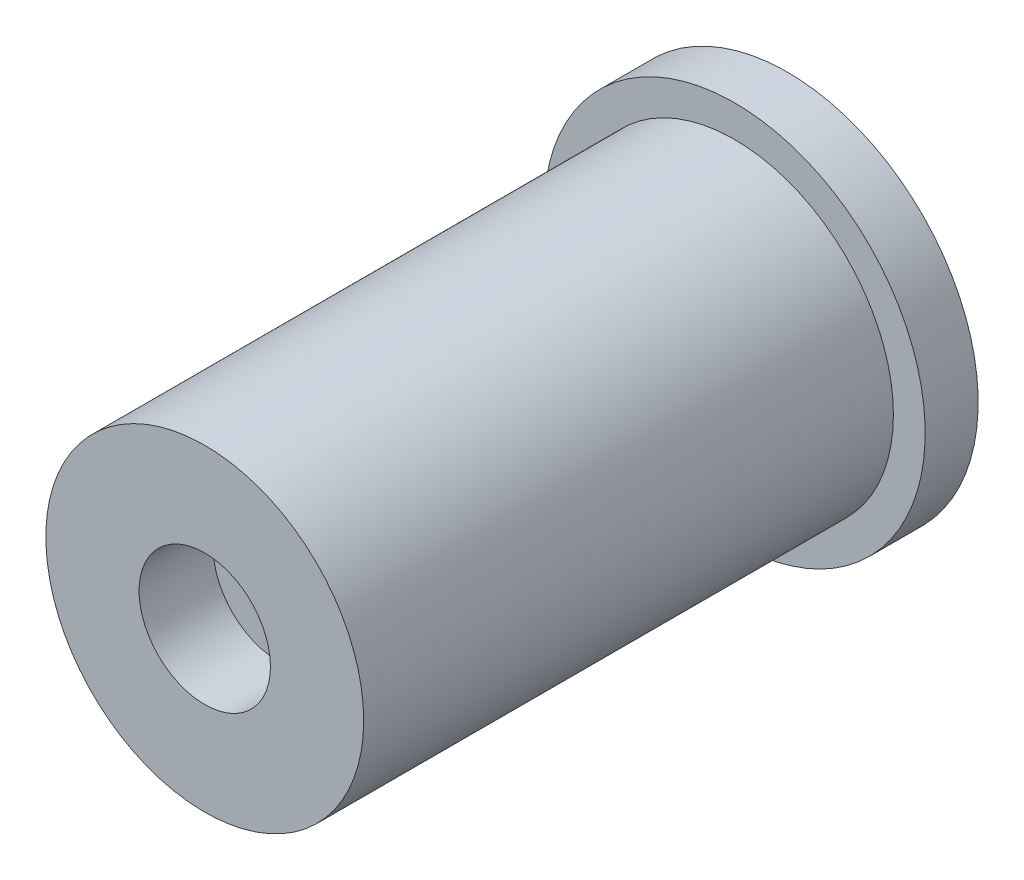
ISO-10303-21;
HEADER;
FILE_DESCRIPTION(('STEP AP214'),'2;1');
FILE_NAME('part.step','',(''),(''),'','','');
FILE_SCHEMA(('AUTOMOTIVE_DESIGN { 1 0 10303 214 1 1 1 1 }'));
ENDSEC;
DATA;
#1=APPLICATION_CONTEXT('core data for automotive mechanical design processes');
#2=APPLICATION_PROTOCOL_DEFINITION('international standard','automotive_design',2000,#1);
#3=PRODUCT_CONTEXT('',#1,'mechanical');
#4=PRODUCT('Part','Part','',(#3));
#5=PRODUCT_RELATED_PRODUCT_CATEGORY('part','',(#4));
#6=PRODUCT_DEFINITION_FORMATION('','',#4);
#7=PRODUCT_DEFINITION_CONTEXT('part definition',#1,'design');
#8=PRODUCT_DEFINITION('design','',#6,#7);
#9=PRODUCT_DEFINITION_SHAPE('','',#8);
#10=(LENGTH_UNIT() NAMED_UNIT(*) SI_UNIT(.MILLI.,.METRE.));
#11=(NAMED_UNIT(*) PLANE_ANGLE_UNIT() SI_UNIT($,.RADIAN.));
#12=(NAMED_UNIT(*) SI_UNIT($,.STERADIAN.) SOLID_ANGLE_UNIT());
#13=UNCERTAINTY_MEASURE_WITH_UNIT(LENGTH_MEASURE(1.E-05),#10,'distance_accuracy_value','');
#14=(GEOMETRIC_REPRESENTATION_CONTEXT(3) GLOBAL_UNCERTAINTY_ASSIGNED_CONTEXT((#13)) GLOBAL_UNIT_ASSIGNED_CONTEXT((#10,
#11,#12)) REPRESENTATION_CONTEXT('',''));
#15=CARTESIAN_POINT('',(0.,0.,0.));
#16=DIRECTION('',(0.,0.,1.));
#17=DIRECTION('',(1.,0.,0.));
#18=AXIS2_PLACEMENT_3D('',#15,#16,#17);
#19=CARTESIAN_POINT('',(0.,0.,25.));
#20=DIRECTION('',(0.,0.,-1.));
#21=DIRECTION('',(-1.,0.,0.));
#22=AXIS2_PLACEMENT_3D('',#19,#20,#21);
#23=CYLINDRICAL_SURFACE('',#22,1.85);
#24=CARTESIAN_POINT('',(0.,0.,5.));
#25=DIRECTION('',(0.,0.,1.));
#26=DIRECTION('',(1.,0.,0.));
#27=AXIS2_PLACEMENT_3D('',#24,#25,#26);
#28=CIRCLE('',#27,1.85);
#29=CARTESIAN_POINT('',(1.85,0.,5.));
#30=VERTEX_POINT('',#29);
#31=EDGE_CURVE('E57',#30,#30,#28,.T.);
#32=ORIENTED_EDGE('',*,*,#31,.T.);
#33=EDGE_LOOP('',(#32));
#34=FACE_BOUND('',#33,.T.);
#35=CARTESIAN_POINT('',(0.,0.,1.5));
#36=DIRECTION('',(0.,0.,-1.));
#37=DIRECTION('',(-1.,0.,0.));
#38=AXIS2_PLACEMENT_3D('',#35,#36,#37);
#39=CIRCLE('',#38,1.85);
#40=CARTESIAN_POINT('',(-1.85,0.,1.5));
#41=VERTEX_POINT('',#40);
#42=EDGE_CURVE('E60',#41,#41,#39,.T.);
#43=ORIENTED_EDGE('',*,*,#42,.T.);
#44=EDGE_LOOP('',(#43));
#45=FACE_BOUND('',#44,.T.);
#46=ADVANCED_FACE('F39',(#34,#45),#23,.F.);
#47=CARTESIAN_POINT('',(0.,0.,20.));
#48=DIRECTION('',(0.,0.,1.));
#49=DIRECTION('',(1.,0.,0.));
#50=AXIS2_PLACEMENT_3D('',#47,#48,#49);
#51=CIRCLE('',#50,1.85);
#52=CARTESIAN_POINT('',(1.85,0.,20.));
#53=VERTEX_POINT('',#52);
#54=EDGE_CURVE('E75',#53,#53,#51,.T.);
#55=ORIENTED_EDGE('',*,*,#54,.F.);
#56=EDGE_LOOP('',(#55));
#57=FACE_BOUND('',#56,.T.);
#58=CARTESIAN_POINT('',(0.,0.,21.5));
#59=DIRECTION('',(0.,0.,1.));
#60=DIRECTION('',(1.,0.,0.));
#61=AXIS2_PLACEMENT_3D('',#58,#59,#60);
#62=CIRCLE('',#61,1.85);
#63=CARTESIAN_POINT('',(1.85,0.,21.5));
#64=VERTEX_POINT('',#63);
#65=EDGE_CURVE('E66',#64,#64,#62,.T.);
#66=ORIENTED_EDGE('',*,*,#65,.T.);
#67=EDGE_LOOP('',(#66));
#68=FACE_BOUND('',#67,.T.);
#69=ADVANCED_FACE('F160',(#57,#68),#23,.F.);
#70=CARTESIAN_POINT('',(0.,0.,5.));
#71=DIRECTION('',(0.,0.,1.));
#72=DIRECTION('',(1.,0.,0.));
#73=AXIS2_PLACEMENT_3D('',#70,#71,#72);
#74=CYLINDRICAL_SURFACE('',#73,6.5);
#75=CARTESIAN_POINT('',(0.,0.,5.));
#76=DIRECTION('',(0.,0.,1.));
#77=DIRECTION('',(1.,0.,0.));
#78=AXIS2_PLACEMENT_3D('',#75,#76,#77);
#79=CIRCLE('',#78,6.5);
#80=CARTESIAN_POINT('',(6.5,0.,5.));
#81=VERTEX_POINT('',#80);
#82=EDGE_CURVE('E79',#81,#81,#79,.T.);
#83=ORIENTED_EDGE('',*,*,#82,.F.);
#84=EDGE_LOOP('',(#83));
#85=FACE_BOUND('',#84,.T.);
#86=CARTESIAN_POINT('',(0.,0.,20.));
#87=DIRECTION('',(0.,0.,1.));
#88=DIRECTION('',(1.,0.,0.));
#89=AXIS2_PLACEMENT_3D('',#86,#87,#88);
#90=CIRCLE('',#89,6.5);
#91=CARTESIAN_POINT('',(6.5,0.,20.));
#92=VERTEX_POINT('',#91);
#93=EDGE_CURVE('E83',#92,#92,#90,.T.);
#94=ORIENTED_EDGE('',*,*,#93,.T.);
#95=EDGE_LOOP('',(#94));
#96=FACE_BOUND('',#95,.T.);
#97=ADVANCED_FACE('F166',(#85,#96),#74,.F.);
#98=CARTESIAN_POINT('',(0.,0.,5.));
#99=DIRECTION('',(0.,0.,1.));
#100=DIRECTION('',(1.,0.,0.));
#101=AXIS2_PLACEMENT_3D('',#98,#99,#100);
#102=PLANE('',#101);
#103=ORIENTED_EDGE('',*,*,#31,.F.);
#104=EDGE_LOOP('',(#103));
#105=FACE_BOUND('',#104,.T.);
#106=ORIENTED_EDGE('',*,*,#82,.T.);
#107=EDGE_LOOP('',(#106));
#108=FACE_BOUND('',#107,.T.);
#109=ADVANCED_FACE('F196',(#105,#108),#102,.T.);
#110=CARTESIAN_POINT('',(0.,0.,20.));
#111=DIRECTION('',(0.,0.,1.));
#112=DIRECTION('',(1.,0.,0.));
#113=AXIS2_PLACEMENT_3D('',#110,#111,#112);
#114=PLANE('',#113);
#115=ORIENTED_EDGE('',*,*,#54,.T.);
#116=EDGE_LOOP('',(#115));
#117=FACE_BOUND('',#116,.T.);
#118=ORIENTED_EDGE('',*,*,#93,.F.);
#119=EDGE_LOOP('',(#118));
#120=FACE_BOUND('',#119,.T.);
#121=ADVANCED_FACE('F187',(#117,#120),#114,.F.);
#122=CARTESIAN_POINT('',(0.,0.,21.5));
#123=DIRECTION('',(0.,0.,1.));
#124=DIRECTION('',(1.,0.,0.));
#125=AXIS2_PLACEMENT_3D('',#122,#123,#124);
#126=CYLINDRICAL_SURFACE('',#125,3.1);
#127=CARTESIAN_POINT('',(0.,0.,21.5));
#128=DIRECTION('',(0.,0.,1.));
#129=DIRECTION('',(1.,0.,0.));
#130=AXIS2_PLACEMENT_3D('',#127,#128,#129);
#131=CIRCLE('',#130,3.1);
#132=CARTESIAN_POINT('',(3.1,0.,21.5));
#133=VERTEX_POINT('',#132);
#134=EDGE_CURVE('E71',#133,#133,#131,.T.);
#135=ORIENTED_EDGE('',*,*,#134,.F.);
#136=EDGE_LOOP('',(#135));
#137=FACE_BOUND('',#136,.T.);
#138=CARTESIAN_POINT('',(0.,0.,25.));
#139=DIRECTION('',(0.,0.,1.));
#140=DIRECTION('',(1.,0.,0.));
#141=AXIS2_PLACEMENT_3D('',#138,#139,#140);
#142=CIRCLE('',#141,3.1);
#143=CARTESIAN_POINT('',(3.1,0.,25.));
#144=VERTEX_POINT('',#143);
#145=EDGE_CURVE('E64',#144,#144,#142,.T.);
#146=ORIENTED_EDGE('',*,*,#145,.T.);
#147=EDGE_LOOP('',(#146));
#148=FACE_BOUND('',#147,.T.);
#149=ADVANCED_FACE('F185',(#137,#148),#126,.F.);
#150=CARTESIAN_POINT('',(0.,0.,21.5));
#151=DIRECTION('',(0.,0.,1.));
#152=DIRECTION('',(1.,0.,0.));
#153=AXIS2_PLACEMENT_3D('',#150,#151,#152);
#154=PLANE('',#153);
#155=ORIENTED_EDGE('',*,*,#65,.F.);
#156=EDGE_LOOP('',(#155));
#157=FACE_BOUND('',#156,.T.);
#158=ORIENTED_EDGE('',*,*,#134,.T.);
#159=EDGE_LOOP('',(#158));
#160=FACE_BOUND('',#159,.T.);
#161=ADVANCED_FACE('F137',(#157,#160),#154,.T.);
#162=CARTESIAN_POINT('',(0.,0.,-2.5));
#163=DIRECTION('',(0.,0.,-1.));
#164=DIRECTION('',(-1.,0.,0.));
#165=AXIS2_PLACEMENT_3D('',#162,#163,#164);
#166=PLANE('',#165);
#167=CARTESIAN_POINT('',(5.5,0.,-2.5));
#168=DIRECTION('',(0.,0.,-1.));
#169=DIRECTION('',(-1.,0.,0.));
#170=AXIS2_PLACEMENT_3D('',#167,#168,#169);
#171=CIRCLE('',#170,1.75);
#172=CARTESIAN_POINT('',(3.75,0.,-2.5));
#173=VERTEX_POINT('',#172);
#174=EDGE_CURVE('E116',#173,#173,#171,.T.);
#175=ORIENTED_EDGE('',*,*,#174,.F.);
#176=EDGE_LOOP('',(#175));
#177=FACE_BOUND('',#176,.T.);
#178=CARTESIAN_POINT('',(-5.5,0.,-2.5));
#179=DIRECTION('',(0.,0.,-1.));
#180=DIRECTION('',(1.,0.,0.));
#181=AXIS2_PLACEMENT_3D('',#178,#179,#180);
#182=CIRCLE('',#181,1.75);
#183=CARTESIAN_POINT('',(-3.75,0.,-2.5));
#184=VERTEX_POINT('',#183);
#185=EDGE_CURVE('E108',#184,#184,#182,.T.);
#186=ORIENTED_EDGE('',*,*,#185,.F.);
#187=EDGE_LOOP('',(#186));
#188=FACE_BOUND('',#187,.T.);
#189=CARTESIAN_POINT('',(0.,0.,-2.5));
#190=DIRECTION('',(0.,0.,-1.));
#191=DIRECTION('',(-1.,0.,0.));
#192=AXIS2_PLACEMENT_3D('',#189,#190,#191);
#193=CIRCLE('',#192,3.575);
#194=CARTESIAN_POINT('',(-3.575,0.,-2.5));
#195=VERTEX_POINT('',#194);
#196=EDGE_CURVE('E10',#195,#195,#193,.F.);
#197=ORIENTED_EDGE('',*,*,#196,.T.);
#198=EDGE_LOOP('',(#197));
#199=FACE_BOUND('',#198,.T.);
#200=CARTESIAN_POINT('',(0.,0.,-2.5));
#201=DIRECTION('',(0.,0.,-1.));
#202=DIRECTION('',(-1.,0.,0.));
#203=AXIS2_PLACEMENT_3D('',#200,#201,#202);
#204=CIRCLE('',#203,9.);
#205=CARTESIAN_POINT('',(-9.,0.,-2.5));
#206=VERTEX_POINT('',#205);
#207=EDGE_CURVE('E84',#206,#206,#204,.T.);
#208=ORIENTED_EDGE('',*,*,#207,.T.);
#209=EDGE_LOOP('',(#208));
#210=FACE_BOUND('',#209,.T.);
#211=ADVANCED_FACE('F133',(#177,#188,#199,#210),#166,.T.);
#212=CARTESIAN_POINT('',(0.,0.,-2.5));
#213=DIRECTION('',(0.,0.,1.));
#214=DIRECTION('',(1.,0.,0.));
#215=AXIS2_PLACEMENT_3D('',#212,#213,#214);
#216=CYLINDRICAL_SURFACE('',#215,9.);
#217=ORIENTED_EDGE('',*,*,#207,.F.);
#218=EDGE_LOOP('',(#217));
#219=FACE_BOUND('',#218,.T.);
#220=CARTESIAN_POINT('',(0.,0.,0.));
#221=DIRECTION('',(0.,0.,-1.));
#222=DIRECTION('',(-1.,0.,0.));
#223=AXIS2_PLACEMENT_3D('',#220,#221,#222);
#224=CIRCLE('',#223,9.);
#225=CARTESIAN_POINT('',(-9.,0.,0.));
#226=VERTEX_POINT('',#225);
#227=EDGE_CURVE('E70',#226,#226,#224,.T.);
#228=ORIENTED_EDGE('',*,*,#227,.T.);
#229=EDGE_LOOP('',(#228));
#230=FACE_BOUND('',#229,.T.);
#231=ADVANCED_FACE('F136',(#219,#230),#216,.T.);
#232=CARTESIAN_POINT('',(0.,0.,0.));
#233=DIRECTION('',(0.,0.,-1.));
#234=DIRECTION('',(-1.,0.,0.));
#235=AXIS2_PLACEMENT_3D('',#232,#233,#234);
#236=PLANE('',#235);
#237=CARTESIAN_POINT('',(0.,0.,0.));
#238=DIRECTION('',(0.,0.,1.));
#239=DIRECTION('',(1.,0.,0.));
#240=AXIS2_PLACEMENT_3D('',#237,#238,#239);
#241=CIRCLE('',#240,7.5);
#242=CARTESIAN_POINT('',(7.5,0.,0.));
#243=VERTEX_POINT('',#242);
#244=EDGE_CURVE('E80',#243,#243,#241,.T.);
#245=ORIENTED_EDGE('',*,*,#244,.F.);
#246=EDGE_LOOP('',(#245));
#247=FACE_BOUND('',#246,.T.);
#248=ORIENTED_EDGE('',*,*,#227,.F.);
#249=EDGE_LOOP('',(#248));
#250=FACE_BOUND('',#249,.T.);
#251=ADVANCED_FACE('F145',(#247,#250),#236,.F.);
#252=CARTESIAN_POINT('',(0.,0.,25.));
#253=DIRECTION('',(0.,0.,-1.));
#254=DIRECTION('',(-1.,0.,0.));
#255=AXIS2_PLACEMENT_3D('',#252,#253,#254);
#256=CYLINDRICAL_SURFACE('',#255,7.5);
#257=CARTESIAN_POINT('',(0.,0.,25.));
#258=DIRECTION('',(0.,0.,1.));
#259=DIRECTION('',(1.,0.,0.));
#260=AXIS2_PLACEMENT_3D('',#257,#258,#259);
#261=CIRCLE('',#260,7.5);
#262=CARTESIAN_POINT('',(7.5,0.,25.));
#263=VERTEX_POINT('',#262);
#264=EDGE_CURVE('E52',#263,#263,#261,.T.);
#265=ORIENTED_EDGE('',*,*,#264,.F.);
#266=EDGE_LOOP('',(#265));
#267=FACE_BOUND('',#266,.T.);
#268=ORIENTED_EDGE('',*,*,#244,.T.);
#269=EDGE_LOOP('',(#268));
#270=FACE_BOUND('',#269,.T.);
#271=ADVANCED_FACE('F150',(#267,#270),#256,.T.);
#272=CARTESIAN_POINT('',(0.,0.,25.));
#273=DIRECTION('',(0.,0.,1.));
#274=DIRECTION('',(1.,0.,0.));
#275=AXIS2_PLACEMENT_3D('',#272,#273,#274);
#276=PLANE('',#275);
#277=ORIENTED_EDGE('',*,*,#145,.F.);
#278=EDGE_LOOP('',(#277));
#279=FACE_BOUND('',#278,.T.);
#280=ORIENTED_EDGE('',*,*,#264,.T.);
#281=EDGE_LOOP('',(#280));
#282=FACE_BOUND('',#281,.T.);
#283=ADVANCED_FACE('F156',(#279,#282),#276,.T.);
#284=CARTESIAN_POINT('',(0.,0.,1.5));
#285=DIRECTION('',(0.,0.,-1.));
#286=DIRECTION('',(-1.,0.,0.));
#287=AXIS2_PLACEMENT_3D('',#284,#285,#286);
#288=CYLINDRICAL_SURFACE('',#287,3.075);
#289=CARTESIAN_POINT('',(0.,0.,-2.));
#290=DIRECTION('',(0.,0.,-1.));
#291=DIRECTION('',(-1.,0.,0.));
#292=AXIS2_PLACEMENT_3D('',#289,#290,#291);
#293=CIRCLE('',#292,3.075);
#294=CARTESIAN_POINT('',(-3.075,0.,-2.));
#295=VERTEX_POINT('',#294);
#296=EDGE_CURVE('E47',#295,#295,#293,.T.);
#297=ORIENTED_EDGE('',*,*,#296,.T.);
#298=EDGE_LOOP('',(#297));
#299=FACE_BOUND('',#298,.T.);
#300=CARTESIAN_POINT('',(0.,0.,1.5));
#301=DIRECTION('',(0.,0.,-1.));
#302=DIRECTION('',(-1.,0.,0.));
#303=AXIS2_PLACEMENT_3D('',#300,#301,#302);
#304=CIRCLE('',#303,3.075);
#305=CARTESIAN_POINT('',(-3.075,0.,1.5));
#306=VERTEX_POINT('',#305);
#307=EDGE_CURVE('E65',#306,#306,#304,.T.);
#308=ORIENTED_EDGE('',*,*,#307,.F.);
#309=EDGE_LOOP('',(#308));
#310=FACE_BOUND('',#309,.T.);
#311=ADVANCED_FACE('F173',(#299,#310),#288,.F.);
#312=CARTESIAN_POINT('',(0.,0.,1.5));
#313=DIRECTION('',(0.,0.,-1.));
#314=DIRECTION('',(-1.,0.,0.));
#315=AXIS2_PLACEMENT_3D('',#312,#313,#314);
#316=PLANE('',#315);
#317=ORIENTED_EDGE('',*,*,#42,.F.);
#318=EDGE_LOOP('',(#317));
#319=FACE_BOUND('',#318,.T.);
#320=ORIENTED_EDGE('',*,*,#307,.T.);
#321=EDGE_LOOP('',(#320));
#322=FACE_BOUND('',#321,.T.);
#323=ADVANCED_FACE('F178',(#319,#322),#316,.T.);
#324=CARTESIAN_POINT('',(0.,0.,-2.));
#325=DIRECTION('',(0.,0.,-1.));
#326=DIRECTION('',(-1.,0.,0.));
#327=AXIS2_PLACEMENT_3D('',#324,#325,#326);
#328=TOROIDAL_SURFACE('',#327,3.575,0.5);
#329=ORIENTED_EDGE('',*,*,#196,.F.);
#330=EDGE_LOOP('',(#329));
#331=FACE_BOUND('',#330,.T.);
#332=ORIENTED_EDGE('',*,*,#296,.F.);
#333=EDGE_LOOP('',(#332));
#334=FACE_BOUND('',#333,.T.);
#335=ADVANCED_FACE('F41',(#331,#334),#328,.T.);
#336=CARTESIAN_POINT('',(-5.5,0.,0.9));
#337=DIRECTION('',(0.,0.,-1.));
#338=DIRECTION('',(-1.,0.,0.));
#339=AXIS2_PLACEMENT_3D('',#336,#337,#338);
#340=CYLINDRICAL_SURFACE('',#339,1.75);
#341=CARTESIAN_POINT('',(-5.5,0.,0.9));
#342=DIRECTION('',(0.,0.,-1.));
#343=DIRECTION('',(1.,0.,0.));
#344=AXIS2_PLACEMENT_3D('',#341,#342,#343);
#345=CIRCLE('',#344,1.75);
#346=CARTESIAN_POINT('',(-3.75,0.,0.9));
#347=VERTEX_POINT('',#346);
#348=EDGE_CURVE('E112',#347,#347,#345,.T.);
#349=ORIENTED_EDGE('',*,*,#348,.F.);
#350=EDGE_LOOP('',(#349));
#351=FACE_BOUND('',#350,.T.);
#352=ORIENTED_EDGE('',*,*,#185,.T.);
#353=EDGE_LOOP('',(#352));
#354=FACE_BOUND('',#353,.T.);
#355=ADVANCED_FACE('F203',(#351,#354),#340,.F.);
#356=CARTESIAN_POINT('',(-5.5,0.,0.9));
#357=DIRECTION('',(0.,0.,1.));
#358=DIRECTION('',(1.,0.,0.));
#359=AXIS2_PLACEMENT_3D('',#356,#357,#358);
#360=PLANE('',#359);
#361=ORIENTED_EDGE('',*,*,#348,.T.);
#362=EDGE_LOOP('',(#361));
#363=FACE_BOUND('',#362,.T.);
#364=ADVANCED_FACE('F129',(#363),#360,.F.);
#365=CARTESIAN_POINT('',(5.5,0.,0.9));
#366=DIRECTION('',(0.,0.,-1.));
#367=DIRECTION('',(-1.,0.,0.));
#368=AXIS2_PLACEMENT_3D('',#365,#366,#367);
#369=CYLINDRICAL_SURFACE('',#368,1.75);
#370=CARTESIAN_POINT('',(5.5,0.,0.9));
#371=DIRECTION('',(0.,0.,-1.));
#372=DIRECTION('',(-1.,0.,0.));
#373=AXIS2_PLACEMENT_3D('',#370,#371,#372);
#374=CIRCLE('',#373,1.75);
#375=CARTESIAN_POINT('',(3.75,0.,0.9));
#376=VERTEX_POINT('',#375);
#377=EDGE_CURVE('E107',#376,#376,#374,.T.);
#378=ORIENTED_EDGE('',*,*,#377,.F.);
#379=EDGE_LOOP('',(#378));
#380=FACE_BOUND('',#379,.T.);
#381=ORIENTED_EDGE('',*,*,#174,.T.);
#382=EDGE_LOOP('',(#381));
#383=FACE_BOUND('',#382,.T.);
#384=ADVANCED_FACE('F126',(#380,#383),#369,.F.);
#385=CARTESIAN_POINT('',(5.5,0.,0.9));
#386=DIRECTION('',(0.,0.,-1.));
#387=DIRECTION('',(-1.,0.,0.));
#388=AXIS2_PLACEMENT_3D('',#385,#386,#387);
#389=PLANE('',#388);
#390=ORIENTED_EDGE('',*,*,#377,.T.);
#391=EDGE_LOOP('',(#390));
#392=FACE_BOUND('',#391,.T.);
#393=ADVANCED_FACE('F124',(#392),#389,.T.);
#394=CLOSED_SHELL('',(#46,#69,#97,#109,#121,#149,#161,#211,#231,#251,#271,#283,#311,#323,#335,
#355,#364,#384,#393));
#395=MANIFOLD_SOLID_BREP('B2',#394);
#396=ADVANCED_BREP_SHAPE_REPRESENTATION('',(#18,#395),#14);
#397=SHAPE_DEFINITION_REPRESENTATION(#9,#396);
ENDSEC;
END-ISO-10303-21;
